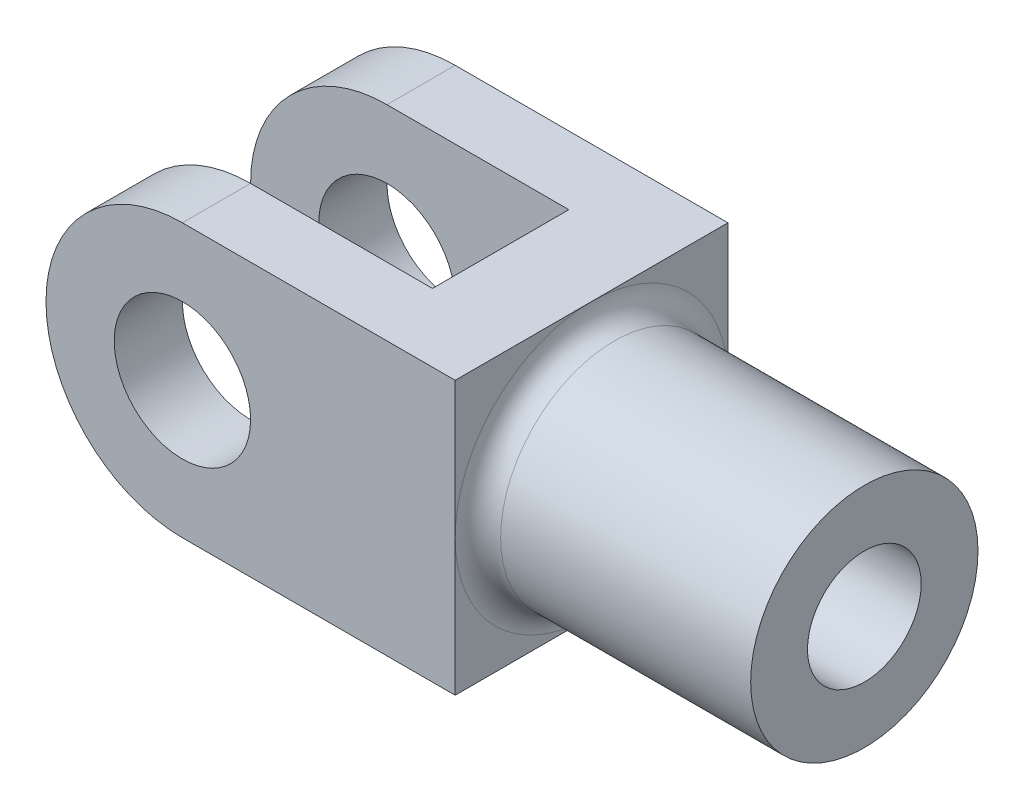
ISO-10303-21;
HEADER;
FILE_DESCRIPTION(('STEP AP214'),'2;1');
FILE_NAME('part.step','',(''),(''),'','','');
FILE_SCHEMA(('AUTOMOTIVE_DESIGN { 1 0 10303 214 1 1 1 1 }'));
ENDSEC;
DATA;
#1=APPLICATION_CONTEXT('core data for automotive mechanical design processes');
#2=APPLICATION_PROTOCOL_DEFINITION('international standard','automotive_design',2000,#1);
#3=PRODUCT_CONTEXT('',#1,'mechanical');
#4=PRODUCT('Part','Part','',(#3));
#5=PRODUCT_RELATED_PRODUCT_CATEGORY('part','',(#4));
#6=PRODUCT_DEFINITION_FORMATION('','',#4);
#7=PRODUCT_DEFINITION_CONTEXT('part definition',#1,'design');
#8=PRODUCT_DEFINITION('design','',#6,#7);
#9=PRODUCT_DEFINITION_SHAPE('','',#8);
#10=(LENGTH_UNIT() NAMED_UNIT(*) SI_UNIT(.MILLI.,.METRE.));
#11=(NAMED_UNIT(*) PLANE_ANGLE_UNIT() SI_UNIT($,.RADIAN.));
#12=(NAMED_UNIT(*) SI_UNIT($,.STERADIAN.) SOLID_ANGLE_UNIT());
#13=UNCERTAINTY_MEASURE_WITH_UNIT(LENGTH_MEASURE(1.E-05),#10,'distance_accuracy_value','');
#14=(GEOMETRIC_REPRESENTATION_CONTEXT(3) GLOBAL_UNCERTAINTY_ASSIGNED_CONTEXT((#13)) GLOBAL_UNIT_ASSIGNED_CONTEXT((#10,
#11,#12)) REPRESENTATION_CONTEXT('',''));
#15=CARTESIAN_POINT('',(0.,0.,0.));
#16=DIRECTION('',(0.,0.,1.));
#17=DIRECTION('',(1.,0.,0.));
#18=AXIS2_PLACEMENT_3D('',#15,#16,#17);
#19=CARTESIAN_POINT('',(12.,-6.,6.));
#20=DIRECTION('',(-1.,0.,0.));
#21=DIRECTION('',(0.,0.,1.));
#22=AXIS2_PLACEMENT_3D('',#19,#20,#21);
#23=PLANE('',#22);
#24=DIRECTION('',(0.,1.,0.));
#25=VECTOR('',#24,1.);
#26=CARTESIAN_POINT('',(12.,-6.,6.));
#27=LINE('',#26,#25);
#28=CARTESIAN_POINT('',(12.,0.,6.));
#29=VERTEX_POINT('',#28);
#30=CARTESIAN_POINT('',(12.,6.,6.));
#31=VERTEX_POINT('',#30);
#32=EDGE_CURVE('E173',#29,#31,#27,.T.);
#33=ORIENTED_EDGE('',*,*,#32,.F.);
#34=CARTESIAN_POINT('',(12.,0.,0.));
#35=DIRECTION('',(-1.,0.,0.));
#36=DIRECTION('',(0.,0.,1.));
#37=AXIS2_PLACEMENT_3D('',#34,#35,#36);
#38=CIRCLE('',#37,6.);
#39=CARTESIAN_POINT('',(12.,6.,0.));
#40=VERTEX_POINT('',#39);
#41=EDGE_CURVE('E11',#29,#40,#38,.T.);
#42=ORIENTED_EDGE('',*,*,#41,.T.);
#43=DIRECTION('',(0.,0.,-1.));
#44=VECTOR('',#43,1.);
#45=CARTESIAN_POINT('',(12.,6.,6.));
#46=LINE('',#45,#44);
#47=EDGE_CURVE('E193',#31,#40,#46,.T.);
#48=ORIENTED_EDGE('',*,*,#47,.F.);
#49=EDGE_LOOP('',(#33,#42,#48));
#50=FACE_BOUND('',#49,.T.);
#51=ADVANCED_FACE('F38',(#50),#23,.F.);
#52=CARTESIAN_POINT('',(12.,6.,-6.));
#53=VERTEX_POINT('',#52);
#54=EDGE_CURVE('E192',#40,#53,#46,.T.);
#55=ORIENTED_EDGE('',*,*,#54,.F.);
#56=CARTESIAN_POINT('',(12.,0.,0.));
#57=DIRECTION('',(-1.,0.,0.));
#58=DIRECTION('',(0.,0.,1.));
#59=AXIS2_PLACEMENT_3D('',#56,#57,#58);
#60=CIRCLE('',#59,6.);
#61=CARTESIAN_POINT('',(12.,0.,-6.));
#62=VERTEX_POINT('',#61);
#63=EDGE_CURVE('E46',#40,#62,#60,.T.);
#64=ORIENTED_EDGE('',*,*,#63,.T.);
#65=DIRECTION('',(0.,1.,0.));
#66=VECTOR('',#65,1.);
#67=CARTESIAN_POINT('',(12.,-6.,-6.));
#68=LINE('',#67,#66);
#69=EDGE_CURVE('E185',#62,#53,#68,.T.);
#70=ORIENTED_EDGE('',*,*,#69,.T.);
#71=EDGE_LOOP('',(#55,#64,#70));
#72=FACE_BOUND('',#71,.T.);
#73=ADVANCED_FACE('F215',(#72),#23,.F.);
#74=CARTESIAN_POINT('',(12.,-6.,-6.));
#75=VERTEX_POINT('',#74);
#76=EDGE_CURVE('E186',#75,#62,#68,.T.);
#77=ORIENTED_EDGE('',*,*,#76,.T.);
#78=CARTESIAN_POINT('',(12.,0.,0.));
#79=DIRECTION('',(-1.,0.,0.));
#80=DIRECTION('',(0.,0.,1.));
#81=AXIS2_PLACEMENT_3D('',#78,#79,#80);
#82=CIRCLE('',#81,6.);
#83=CARTESIAN_POINT('',(12.,-6.,0.));
#84=VERTEX_POINT('',#83);
#85=EDGE_CURVE('E53',#62,#84,#82,.T.);
#86=ORIENTED_EDGE('',*,*,#85,.T.);
#87=DIRECTION('',(0.,0.,-1.));
#88=VECTOR('',#87,1.);
#89=CARTESIAN_POINT('',(12.,-6.,6.));
#90=LINE('',#89,#88);
#91=EDGE_CURVE('E196',#84,#75,#90,.T.);
#92=ORIENTED_EDGE('',*,*,#91,.T.);
#93=EDGE_LOOP('',(#77,#86,#92));
#94=FACE_BOUND('',#93,.T.);
#95=ADVANCED_FACE('F225',(#94),#23,.F.);
#96=CARTESIAN_POINT('',(0.,0.,6.));
#97=DIRECTION('',(0.,0.,-1.));
#98=DIRECTION('',(-1.,0.,0.));
#99=AXIS2_PLACEMENT_3D('',#96,#97,#98);
#100=CYLINDRICAL_SURFACE('',#99,6.);
#101=CARTESIAN_POINT('',(0.,0.,-3.));
#102=DIRECTION('',(0.,0.,-1.));
#103=DIRECTION('',(-1.,0.,0.));
#104=AXIS2_PLACEMENT_3D('',#101,#102,#103);
#105=CIRCLE('',#104,6.);
#106=CARTESIAN_POINT('',(0.,-6.,-3.));
#107=VERTEX_POINT('',#106);
#108=CARTESIAN_POINT('',(0.,6.,-3.));
#109=VERTEX_POINT('',#108);
#110=EDGE_CURVE('E158',#107,#109,#105,.T.);
#111=ORIENTED_EDGE('',*,*,#110,.T.);
#112=DIRECTION('',(0.,0.,-1.));
#113=VECTOR('',#112,1.);
#114=CARTESIAN_POINT('',(0.,6.,6.));
#115=LINE('',#114,#113);
#116=CARTESIAN_POINT('',(0.,6.,-6.));
#117=VERTEX_POINT('',#116);
#118=EDGE_CURVE('E179',#109,#117,#115,.T.);
#119=ORIENTED_EDGE('',*,*,#118,.T.);
#120=CARTESIAN_POINT('',(0.,0.,-6.));
#121=DIRECTION('',(0.,0.,1.));
#122=DIRECTION('',(-1.,0.,0.));
#123=AXIS2_PLACEMENT_3D('',#120,#121,#122);
#124=CIRCLE('',#123,6.);
#125=CARTESIAN_POINT('',(0.,-6.,-6.));
#126=VERTEX_POINT('',#125);
#127=EDGE_CURVE('E164',#117,#126,#124,.T.);
#128=ORIENTED_EDGE('',*,*,#127,.T.);
#129=DIRECTION('',(0.,0.,-1.));
#130=VECTOR('',#129,1.);
#131=CARTESIAN_POINT('',(0.,-6.,6.));
#132=LINE('',#131,#130);
#133=EDGE_CURVE('E199',#107,#126,#132,.T.);
#134=ORIENTED_EDGE('',*,*,#133,.F.);
#135=EDGE_LOOP('',(#111,#119,#128,#134));
#136=FACE_BOUND('',#135,.T.);
#137=ADVANCED_FACE('F239',(#136),#100,.T.);
#138=CARTESIAN_POINT('',(0.,0.,6.));
#139=DIRECTION('',(0.,0.,-1.));
#140=DIRECTION('',(-1.,0.,0.));
#141=AXIS2_PLACEMENT_3D('',#138,#139,#140);
#142=CYLINDRICAL_SURFACE('',#141,3.);
#143=CARTESIAN_POINT('',(0.,0.,-3.));
#144=DIRECTION('',(0.,0.,-1.));
#145=DIRECTION('',(-1.,0.,0.));
#146=AXIS2_PLACEMENT_3D('',#143,#144,#145);
#147=CIRCLE('',#146,3.);
#148=CARTESIAN_POINT('',(-3.,0.,-3.));
#149=VERTEX_POINT('',#148);
#150=EDGE_CURVE('E157',#149,#149,#147,.T.);
#151=ORIENTED_EDGE('',*,*,#150,.F.);
#152=EDGE_LOOP('',(#151));
#153=FACE_BOUND('',#152,.T.);
#154=CARTESIAN_POINT('',(0.,0.,-6.));
#155=DIRECTION('',(0.,0.,1.));
#156=DIRECTION('',(1.,0.,0.));
#157=AXIS2_PLACEMENT_3D('',#154,#155,#156);
#158=CIRCLE('',#157,3.);
#159=CARTESIAN_POINT('',(3.,0.,-6.));
#160=VERTEX_POINT('',#159);
#161=EDGE_CURVE('E160',#160,#160,#158,.T.);
#162=ORIENTED_EDGE('',*,*,#161,.F.);
#163=EDGE_LOOP('',(#162));
#164=FACE_BOUND('',#163,.T.);
#165=ADVANCED_FACE('F259',(#153,#164),#142,.F.);
#166=CARTESIAN_POINT('',(0.,0.,6.));
#167=DIRECTION('',(0.,0.,-1.));
#168=DIRECTION('',(-1.,0.,0.));
#169=AXIS2_PLACEMENT_3D('',#166,#167,#168);
#170=PLANE('',#169);
#171=CARTESIAN_POINT('',(0.,0.,6.));
#172=DIRECTION('',(0.,0.,1.));
#173=DIRECTION('',(-1.,0.,0.));
#174=AXIS2_PLACEMENT_3D('',#171,#172,#173);
#175=CIRCLE('',#174,6.);
#176=CARTESIAN_POINT('',(0.,6.,6.));
#177=VERTEX_POINT('',#176);
#178=CARTESIAN_POINT('',(0.,-6.,6.));
#179=VERTEX_POINT('',#178);
#180=EDGE_CURVE('E167',#177,#179,#175,.T.);
#181=ORIENTED_EDGE('',*,*,#180,.T.);
#182=DIRECTION('',(1.,0.,0.));
#183=VECTOR('',#182,1.);
#184=CARTESIAN_POINT('',(0.,-6.,6.));
#185=LINE('',#184,#183);
#186=CARTESIAN_POINT('',(12.,-6.,6.));
#187=VERTEX_POINT('',#186);
#188=EDGE_CURVE('E170',#179,#187,#185,.T.);
#189=ORIENTED_EDGE('',*,*,#188,.T.);
#190=EDGE_CURVE('E174',#187,#29,#27,.T.);
#191=ORIENTED_EDGE('',*,*,#190,.T.);
#192=ORIENTED_EDGE('',*,*,#32,.T.);
#193=DIRECTION('',(-1.,0.,0.));
#194=VECTOR('',#193,1.);
#195=CARTESIAN_POINT('',(12.,6.,6.));
#196=LINE('',#195,#194);
#197=EDGE_CURVE('E177',#31,#177,#196,.T.);
#198=ORIENTED_EDGE('',*,*,#197,.T.);
#199=EDGE_LOOP('',(#181,#189,#191,#192,#198));
#200=FACE_BOUND('',#199,.T.);
#201=CARTESIAN_POINT('',(0.,0.,6.));
#202=DIRECTION('',(0.,0.,1.));
#203=DIRECTION('',(1.,0.,0.));
#204=AXIS2_PLACEMENT_3D('',#201,#202,#203);
#205=CIRCLE('',#204,3.);
#206=CARTESIAN_POINT('',(3.,0.,6.));
#207=VERTEX_POINT('',#206);
#208=EDGE_CURVE('E161',#207,#207,#205,.T.);
#209=ORIENTED_EDGE('',*,*,#208,.F.);
#210=EDGE_LOOP('',(#209));
#211=FACE_BOUND('',#210,.T.);
#212=ADVANCED_FACE('F231',(#200,#211),#170,.F.);
#213=CARTESIAN_POINT('',(0.,0.,-6.));
#214=DIRECTION('',(0.,0.,-1.));
#215=DIRECTION('',(-1.,0.,0.));
#216=AXIS2_PLACEMENT_3D('',#213,#214,#215);
#217=PLANE('',#216);
#218=ORIENTED_EDGE('',*,*,#127,.F.);
#219=DIRECTION('',(-1.,0.,0.));
#220=VECTOR('',#219,1.);
#221=CARTESIAN_POINT('',(12.,6.,-6.));
#222=LINE('',#221,#220);
#223=EDGE_CURVE('E171',#53,#117,#222,.T.);
#224=ORIENTED_EDGE('',*,*,#223,.F.);
#225=ORIENTED_EDGE('',*,*,#69,.F.);
#226=ORIENTED_EDGE('',*,*,#76,.F.);
#227=DIRECTION('',(1.,0.,0.));
#228=VECTOR('',#227,1.);
#229=CARTESIAN_POINT('',(0.,-6.,-6.));
#230=LINE('',#229,#228);
#231=EDGE_CURVE('E182',#126,#75,#230,.T.);
#232=ORIENTED_EDGE('',*,*,#231,.F.);
#233=EDGE_LOOP('',(#218,#224,#225,#226,#232));
#234=FACE_BOUND('',#233,.T.);
#235=ORIENTED_EDGE('',*,*,#161,.T.);
#236=EDGE_LOOP('',(#235));
#237=FACE_BOUND('',#236,.T.);
#238=ADVANCED_FACE('F222',(#234,#237),#217,.T.);
#239=CARTESIAN_POINT('',(0.,6.,3.));
#240=VERTEX_POINT('',#239);
#241=EDGE_CURVE('E190',#177,#240,#115,.T.);
#242=ORIENTED_EDGE('',*,*,#241,.T.);
#243=CARTESIAN_POINT('',(0.,0.,3.));
#244=DIRECTION('',(0.,0.,1.));
#245=DIRECTION('',(1.,0.,0.));
#246=AXIS2_PLACEMENT_3D('',#243,#244,#245);
#247=CIRCLE('',#246,6.);
#248=CARTESIAN_POINT('',(0.,-6.,3.));
#249=VERTEX_POINT('',#248);
#250=EDGE_CURVE('E123',#240,#249,#247,.T.);
#251=ORIENTED_EDGE('',*,*,#250,.T.);
#252=EDGE_CURVE('E200',#179,#249,#132,.T.);
#253=ORIENTED_EDGE('',*,*,#252,.F.);
#254=ORIENTED_EDGE('',*,*,#180,.F.);
#255=EDGE_LOOP('',(#242,#251,#253,#254));
#256=FACE_BOUND('',#255,.T.);
#257=ADVANCED_FACE('F243',(#256),#100,.T.);
#258=CARTESIAN_POINT('',(0.,-6.,6.));
#259=DIRECTION('',(0.,1.,0.));
#260=DIRECTION('',(0.,0.,1.));
#261=AXIS2_PLACEMENT_3D('',#258,#259,#260);
#262=PLANE('',#261);
#263=DIRECTION('',(0.,0.,-1.));
#264=VECTOR('',#263,1.);
#265=CARTESIAN_POINT('',(8.,-6.,-3.));
#266=LINE('',#265,#264);
#267=CARTESIAN_POINT('',(8.,-6.,3.));
#268=VERTEX_POINT('',#267);
#269=CARTESIAN_POINT('',(8.,-6.,-3.));
#270=VERTEX_POINT('',#269);
#271=EDGE_CURVE('E136',#268,#270,#266,.T.);
#272=ORIENTED_EDGE('',*,*,#271,.T.);
#273=DIRECTION('',(-1.,0.,0.));
#274=VECTOR('',#273,1.);
#275=CARTESIAN_POINT('',(8.,-6.,-3.));
#276=LINE('',#275,#274);
#277=EDGE_CURVE('E139',#270,#107,#276,.T.);
#278=ORIENTED_EDGE('',*,*,#277,.T.);
#279=ORIENTED_EDGE('',*,*,#133,.T.);
#280=ORIENTED_EDGE('',*,*,#231,.T.);
#281=ORIENTED_EDGE('',*,*,#91,.F.);
#282=EDGE_CURVE('E197',#187,#84,#90,.T.);
#283=ORIENTED_EDGE('',*,*,#282,.F.);
#284=ORIENTED_EDGE('',*,*,#188,.F.);
#285=ORIENTED_EDGE('',*,*,#252,.T.);
#286=DIRECTION('',(1.,0.,0.));
#287=VECTOR('',#286,1.);
#288=CARTESIAN_POINT('',(8.,-6.,3.));
#289=LINE('',#288,#287);
#290=EDGE_CURVE('E146',#249,#268,#289,.T.);
#291=ORIENTED_EDGE('',*,*,#290,.T.);
#292=EDGE_LOOP('',(#272,#278,#279,#280,#281,#283,#284,#285,#291));
#293=FACE_BOUND('',#292,.T.);
#294=ADVANCED_FACE('F236',(#293),#262,.F.);
#295=ORIENTED_EDGE('',*,*,#282,.T.);
#296=CARTESIAN_POINT('',(12.,0.,0.));
#297=DIRECTION('',(-1.,0.,0.));
#298=DIRECTION('',(0.,0.,1.));
#299=AXIS2_PLACEMENT_3D('',#296,#297,#298);
#300=CIRCLE('',#299,6.);
#301=EDGE_CURVE('E61',#84,#29,#300,.T.);
#302=ORIENTED_EDGE('',*,*,#301,.T.);
#303=ORIENTED_EDGE('',*,*,#190,.F.);
#304=EDGE_LOOP('',(#295,#302,#303));
#305=FACE_BOUND('',#304,.T.);
#306=ADVANCED_FACE('F234',(#305),#23,.F.);
#307=CARTESIAN_POINT('',(12.,6.,6.));
#308=DIRECTION('',(0.,-1.,0.));
#309=DIRECTION('',(0.,0.,-1.));
#310=AXIS2_PLACEMENT_3D('',#307,#308,#309);
#311=PLANE('',#310);
#312=ORIENTED_EDGE('',*,*,#118,.F.);
#313=DIRECTION('',(-1.,0.,0.));
#314=VECTOR('',#313,1.);
#315=CARTESIAN_POINT('',(8.,6.,-3.));
#316=LINE('',#315,#314);
#317=CARTESIAN_POINT('',(8.,6.,-3.));
#318=VERTEX_POINT('',#317);
#319=EDGE_CURVE('E144',#318,#109,#316,.T.);
#320=ORIENTED_EDGE('',*,*,#319,.F.);
#321=DIRECTION('',(0.,0.,-1.));
#322=VECTOR('',#321,1.);
#323=CARTESIAN_POINT('',(8.,6.,-3.));
#324=LINE('',#323,#322);
#325=CARTESIAN_POINT('',(8.,6.,3.));
#326=VERTEX_POINT('',#325);
#327=EDGE_CURVE('E128',#326,#318,#324,.T.);
#328=ORIENTED_EDGE('',*,*,#327,.F.);
#329=DIRECTION('',(1.,0.,0.));
#330=VECTOR('',#329,1.);
#331=CARTESIAN_POINT('',(8.,6.,3.));
#332=LINE('',#331,#330);
#333=EDGE_CURVE('E117',#240,#326,#332,.T.);
#334=ORIENTED_EDGE('',*,*,#333,.F.);
#335=ORIENTED_EDGE('',*,*,#241,.F.);
#336=ORIENTED_EDGE('',*,*,#197,.F.);
#337=ORIENTED_EDGE('',*,*,#47,.T.);
#338=ORIENTED_EDGE('',*,*,#54,.T.);
#339=ORIENTED_EDGE('',*,*,#223,.T.);
#340=EDGE_LOOP('',(#312,#320,#328,#334,#335,#336,#337,#338,#339));
#341=FACE_BOUND('',#340,.T.);
#342=ADVANCED_FACE('F142',(#341),#311,.F.);
#343=CARTESIAN_POINT('',(0.,0.,3.));
#344=DIRECTION('',(0.,0.,1.));
#345=DIRECTION('',(1.,0.,0.));
#346=AXIS2_PLACEMENT_3D('',#343,#344,#345);
#347=CIRCLE('',#346,3.);
#348=CARTESIAN_POINT('',(3.,0.,3.));
#349=VERTEX_POINT('',#348);
#350=EDGE_CURVE('E154',#349,#349,#347,.T.);
#351=ORIENTED_EDGE('',*,*,#350,.F.);
#352=EDGE_LOOP('',(#351));
#353=FACE_BOUND('',#352,.T.);
#354=ORIENTED_EDGE('',*,*,#208,.T.);
#355=EDGE_LOOP('',(#354));
#356=FACE_BOUND('',#355,.T.);
#357=ADVANCED_FACE('F248',(#353,#356),#142,.F.);
#358=CARTESIAN_POINT('',(8.,-6.,-3.));
#359=DIRECTION('',(0.,0.,-1.));
#360=DIRECTION('',(-1.,0.,0.));
#361=AXIS2_PLACEMENT_3D('',#358,#359,#360);
#362=PLANE('',#361);
#363=ORIENTED_EDGE('',*,*,#150,.T.);
#364=EDGE_LOOP('',(#363));
#365=FACE_BOUND('',#364,.T.);
#366=ORIENTED_EDGE('',*,*,#110,.F.);
#367=ORIENTED_EDGE('',*,*,#277,.F.);
#368=DIRECTION('',(0.,1.,0.));
#369=VECTOR('',#368,1.);
#370=CARTESIAN_POINT('',(8.,-6.,-3.));
#371=LINE('',#370,#369);
#372=EDGE_CURVE('E138',#270,#318,#371,.T.);
#373=ORIENTED_EDGE('',*,*,#372,.T.);
#374=ORIENTED_EDGE('',*,*,#319,.T.);
#375=EDGE_LOOP('',(#366,#367,#373,#374));
#376=FACE_BOUND('',#375,.T.);
#377=ADVANCED_FACE('F246',(#365,#376),#362,.F.);
#378=CARTESIAN_POINT('',(8.,-6.,3.));
#379=DIRECTION('',(0.,0.,1.));
#380=DIRECTION('',(1.,0.,0.));
#381=AXIS2_PLACEMENT_3D('',#378,#379,#380);
#382=PLANE('',#381);
#383=ORIENTED_EDGE('',*,*,#350,.T.);
#384=EDGE_LOOP('',(#383));
#385=FACE_BOUND('',#384,.T.);
#386=ORIENTED_EDGE('',*,*,#333,.T.);
#387=DIRECTION('',(0.,1.,0.));
#388=VECTOR('',#387,1.);
#389=CARTESIAN_POINT('',(8.,-6.,3.));
#390=LINE('',#389,#388);
#391=EDGE_CURVE('E121',#268,#326,#390,.T.);
#392=ORIENTED_EDGE('',*,*,#391,.F.);
#393=ORIENTED_EDGE('',*,*,#290,.F.);
#394=ORIENTED_EDGE('',*,*,#250,.F.);
#395=EDGE_LOOP('',(#386,#392,#393,#394));
#396=FACE_BOUND('',#395,.T.);
#397=ADVANCED_FACE('F119',(#385,#396),#382,.F.);
#398=CARTESIAN_POINT('',(8.,-6.,-3.));
#399=DIRECTION('',(1.,0.,0.));
#400=DIRECTION('',(0.,0.,-1.));
#401=AXIS2_PLACEMENT_3D('',#398,#399,#400);
#402=PLANE('',#401);
#403=ORIENTED_EDGE('',*,*,#372,.F.);
#404=ORIENTED_EDGE('',*,*,#271,.F.);
#405=ORIENTED_EDGE('',*,*,#391,.T.);
#406=ORIENTED_EDGE('',*,*,#327,.T.);
#407=EDGE_LOOP('',(#403,#404,#405,#406));
#408=FACE_BOUND('',#407,.T.);
#409=ADVANCED_FACE('F133',(#408),#402,.F.);
#410=CARTESIAN_POINT('',(24.,0.,0.));
#411=DIRECTION('',(-1.,0.,0.));
#412=DIRECTION('',(0.,0.,1.));
#413=AXIS2_PLACEMENT_3D('',#410,#411,#412);
#414=CYLINDRICAL_SURFACE('',#413,2.5);
#415=CARTESIAN_POINT('',(24.,0.,0.));
#416=DIRECTION('',(1.,0.,0.));
#417=DIRECTION('',(0.,0.,-1.));
#418=AXIS2_PLACEMENT_3D('',#415,#416,#417);
#419=CIRCLE('',#418,2.5);
#420=CARTESIAN_POINT('',(24.,0.,-2.5));
#421=VERTEX_POINT('',#420);
#422=EDGE_CURVE('E317',#421,#421,#419,.T.);
#423=ORIENTED_EDGE('',*,*,#422,.T.);
#424=EDGE_LOOP('',(#423));
#425=FACE_BOUND('',#424,.T.);
#426=CARTESIAN_POINT('',(12.,0.,0.));
#427=DIRECTION('',(1.,0.,0.));
#428=DIRECTION('',(0.,0.,-1.));
#429=AXIS2_PLACEMENT_3D('',#426,#427,#428);
#430=CIRCLE('',#429,2.5);
#431=CARTESIAN_POINT('',(12.,0.,-2.5));
#432=VERTEX_POINT('',#431);
#433=EDGE_CURVE('E319',#432,#432,#430,.T.);
#434=ORIENTED_EDGE('',*,*,#433,.F.);
#435=EDGE_LOOP('',(#434));
#436=FACE_BOUND('',#435,.T.);
#437=ADVANCED_FACE('F304',(#425,#436),#414,.F.);
#438=CARTESIAN_POINT('',(24.,0.,0.));
#439=DIRECTION('',(-1.,0.,0.));
#440=DIRECTION('',(0.,0.,1.));
#441=AXIS2_PLACEMENT_3D('',#438,#439,#440);
#442=CYLINDRICAL_SURFACE('',#441,5.);
#443=CARTESIAN_POINT('',(13.,0.,0.));
#444=DIRECTION('',(-1.,0.,0.));
#445=DIRECTION('',(0.,0.,1.));
#446=AXIS2_PLACEMENT_3D('',#443,#444,#445);
#447=CIRCLE('',#446,5.);
#448=CARTESIAN_POINT('',(13.,0.,5.));
#449=VERTEX_POINT('',#448);
#450=EDGE_CURVE('E203',#449,#449,#447,.F.);
#451=ORIENTED_EDGE('',*,*,#450,.T.);
#452=EDGE_LOOP('',(#451));
#453=FACE_BOUND('',#452,.T.);
#454=CARTESIAN_POINT('',(24.,0.,0.));
#455=DIRECTION('',(1.,0.,0.));
#456=DIRECTION('',(0.,0.,-1.));
#457=AXIS2_PLACEMENT_3D('',#454,#455,#456);
#458=CIRCLE('',#457,5.);
#459=CARTESIAN_POINT('',(24.,0.,-5.));
#460=VERTEX_POINT('',#459);
#461=EDGE_CURVE('E129',#460,#460,#458,.T.);
#462=ORIENTED_EDGE('',*,*,#461,.F.);
#463=EDGE_LOOP('',(#462));
#464=FACE_BOUND('',#463,.T.);
#465=ADVANCED_FACE('F282',(#453,#464),#442,.T.);
#466=CARTESIAN_POINT('',(24.,0.,0.));
#467=DIRECTION('',(1.,0.,0.));
#468=DIRECTION('',(0.,0.,-1.));
#469=AXIS2_PLACEMENT_3D('',#466,#467,#468);
#470=PLANE('',#469);
#471=ORIENTED_EDGE('',*,*,#422,.F.);
#472=EDGE_LOOP('',(#471));
#473=FACE_BOUND('',#472,.T.);
#474=ORIENTED_EDGE('',*,*,#461,.T.);
#475=EDGE_LOOP('',(#474));
#476=FACE_BOUND('',#475,.T.);
#477=ADVANCED_FACE('F276',(#473,#476),#470,.T.);
#478=ORIENTED_EDGE('',*,*,#433,.T.);
#479=EDGE_LOOP('',(#478));
#480=FACE_BOUND('',#479,.T.);
#481=ADVANCED_FACE('F270',(#480),#23,.F.);
#482=CARTESIAN_POINT('',(13.,0.,0.));
#483=DIRECTION('',(-1.,0.,0.));
#484=DIRECTION('',(0.,0.,1.));
#485=AXIS2_PLACEMENT_3D('',#482,#483,#484);
#486=TOROIDAL_SURFACE('',#485,6.,1.);
#487=ORIENTED_EDGE('',*,*,#63,.F.);
#488=ORIENTED_EDGE('',*,*,#41,.F.);
#489=ORIENTED_EDGE('',*,*,#301,.F.);
#490=ORIENTED_EDGE('',*,*,#85,.F.);
#491=EDGE_LOOP('',(#487,#488,#489,#490));
#492=FACE_BOUND('',#491,.T.);
#493=ORIENTED_EDGE('',*,*,#450,.F.);
#494=EDGE_LOOP('',(#493));
#495=FACE_BOUND('',#494,.T.);
#496=ADVANCED_FACE('F40',(#492,#495),#486,.F.);
#497=CLOSED_SHELL('',(#51,#73,#95,#137,#165,#212,#238,#257,#294,#306,#342,#357,#377,#397,#409,
#437,#465,#477,#481,#496));
#498=MANIFOLD_SOLID_BREP('B2',#497);
#499=ADVANCED_BREP_SHAPE_REPRESENTATION('',(#18,#498),#14);
#500=SHAPE_DEFINITION_REPRESENTATION(#9,#499);
ENDSEC;
END-ISO-10303-21;
